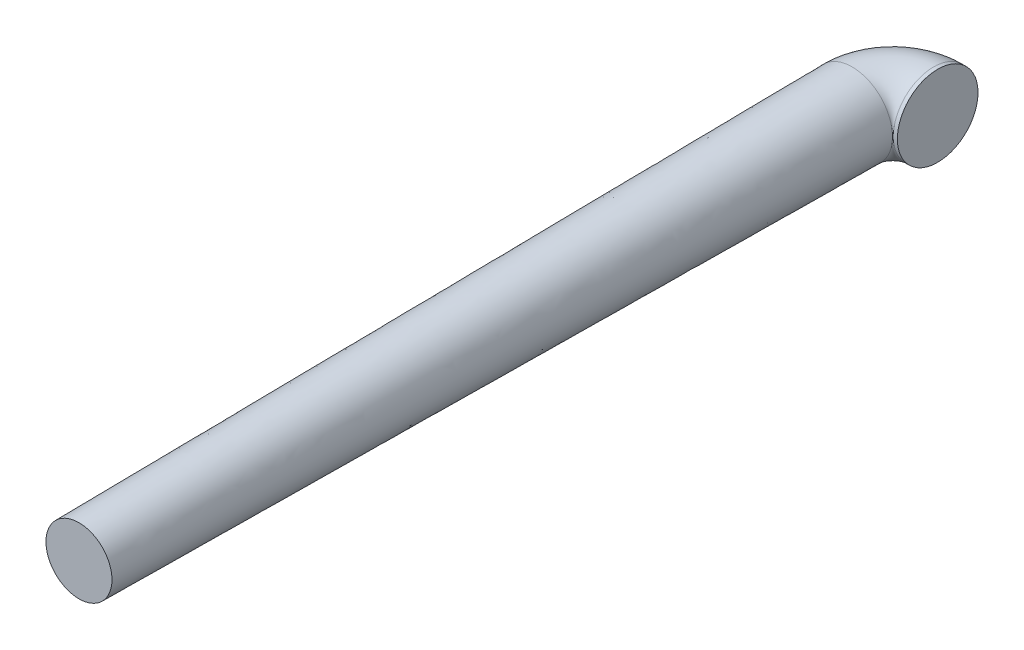
ISO-10303-21;
HEADER;
FILE_DESCRIPTION(('STEP AP214'),'2;1');
FILE_NAME('part.step','',(''),(''),'','','');
FILE_SCHEMA(('AUTOMOTIVE_DESIGN { 1 0 10303 214 1 1 1 1 }'));
ENDSEC;
DATA;
#1=APPLICATION_CONTEXT('core data for automotive mechanical design processes');
#2=APPLICATION_PROTOCOL_DEFINITION('international standard','automotive_design',2000,#1);
#3=PRODUCT_CONTEXT('',#1,'mechanical');
#4=PRODUCT('Part','Part','',(#3));
#5=PRODUCT_RELATED_PRODUCT_CATEGORY('part','',(#4));
#6=PRODUCT_DEFINITION_FORMATION('','',#4);
#7=PRODUCT_DEFINITION_CONTEXT('part definition',#1,'design');
#8=PRODUCT_DEFINITION('design','',#6,#7);
#9=PRODUCT_DEFINITION_SHAPE('','',#8);
#10=(LENGTH_UNIT() NAMED_UNIT(*) SI_UNIT(.MILLI.,.METRE.));
#11=(NAMED_UNIT(*) PLANE_ANGLE_UNIT() SI_UNIT($,.RADIAN.));
#12=(NAMED_UNIT(*) SI_UNIT($,.STERADIAN.) SOLID_ANGLE_UNIT());
#13=UNCERTAINTY_MEASURE_WITH_UNIT(LENGTH_MEASURE(1.E-05),#10,'distance_accuracy_value','');
#14=(GEOMETRIC_REPRESENTATION_CONTEXT(3) GLOBAL_UNCERTAINTY_ASSIGNED_CONTEXT((#13)) GLOBAL_UNIT_ASSIGNED_CONTEXT((#10,
#11,#12)) REPRESENTATION_CONTEXT('',''));
#15=CARTESIAN_POINT('',(0.,0.,0.));
#16=DIRECTION('',(0.,0.,1.));
#17=DIRECTION('',(1.,0.,0.));
#18=AXIS2_PLACEMENT_3D('',#15,#16,#17);
#19=CARTESIAN_POINT('',(0.539999999999999,0.,-10.));
#20=DIRECTION('',(-1.,0.,0.));
#21=DIRECTION('',(0.,0.,1.));
#22=AXIS2_PLACEMENT_3D('',#19,#20,#21);
#23=PLANE('',#22);
#24=CARTESIAN_POINT('',(0.539999999999999,0.,-10.));
#25=DIRECTION('',(1.,0.,0.));
#26=DIRECTION('',(0.,0.,-1.));
#27=AXIS2_PLACEMENT_3D('',#24,#25,#26);
#28=CIRCLE('',#27,0.495);
#29=CARTESIAN_POINT('',(0.539999999999999,0.,-10.495));
#30=VERTEX_POINT('',#29);
#31=EDGE_CURVE('E24',#30,#30,#28,.F.);
#32=ORIENTED_EDGE('',*,*,#31,.F.);
#33=EDGE_LOOP('',(#32));
#34=FACE_BOUND('',#33,.T.);
#35=ADVANCED_FACE('F17',(#34),#23,.F.);
#36=CARTESIAN_POINT('',(0.489999999999998,0.,-10.));
#37=DIRECTION('',(1.,0.,0.));
#38=DIRECTION('',(0.,0.,-1.));
#39=AXIS2_PLACEMENT_3D('',#36,#37,#38);
#40=CYLINDRICAL_SURFACE('',#39,0.495);
#41=CARTESIAN_POINT('',(0.489999999999805,0.,-10.));
#42=DIRECTION('',(1.,0.,-3.90982201687927E-13));
#43=DIRECTION('',(-3.90982201687927E-13,0.,-1.));
#44=AXIS2_PLACEMENT_3D('',#41,#42,#43);
#45=CIRCLE('',#44,0.495);
#46=CARTESIAN_POINT('',(0.489999999999611,0.,-10.495));
#47=VERTEX_POINT('',#46);
#48=EDGE_CURVE('E76',#47,#47,#45,.F.);
#49=ORIENTED_EDGE('',*,*,#48,.F.);
#50=EDGE_LOOP('',(#49));
#51=FACE_BOUND('',#50,.T.);
#52=ORIENTED_EDGE('',*,*,#31,.T.);
#53=EDGE_LOOP('',(#52));
#54=FACE_BOUND('',#53,.T.);
#55=ADVANCED_FACE('F85',(#51,#54),#40,.T.);
#56=CARTESIAN_POINT('',(0.,0.,0.));
#57=DIRECTION('',(0.,0.,1.));
#58=DIRECTION('',(1.,0.,0.));
#59=AXIS2_PLACEMENT_3D('',#56,#57,#58);
#60=PLANE('',#59);
#61=CARTESIAN_POINT('',(0.405,0.,0.));
#62=CARTESIAN_POINT('',(0.405001542596249,0.0228547633774567,0.));
#63=CARTESIAN_POINT('',(0.402970398994823,0.0456972250512238,0.));
#64=CARTESIAN_POINT('',(0.395089178677017,0.0907629467243884,0.));
#65=CARTESIAN_POINT('',(0.389230262427667,0.112984649029221,0.));
#66=CARTESIAN_POINT('',(0.373950730485416,0.156119825287532,0.));
#67=CARTESIAN_POINT('',(0.364536390196654,0.177035528996636,0.));
#68=CARTESIAN_POINT('',(0.342401176876951,0.217009374121165,0.));
#69=CARTESIAN_POINT('',(0.329684520750042,0.236069842218566,0.));
#70=CARTESIAN_POINT('',(0.300980172785983,0.271948883439179,0.));
#71=CARTESIAN_POINT('',(0.284954038104707,0.288736875650813,0.));
#72=CARTESIAN_POINT('',(0.250183749593743,0.319224855679917,0.));
#73=CARTESIAN_POINT('',(0.231437944176502,0.332922954075675,0.));
#74=CARTESIAN_POINT('',(0.192646035180543,0.356540872452389,0.));
#75=CARTESIAN_POINT('',(0.172672102927332,0.366580075497198,0.));
#76=CARTESIAN_POINT('',(0.131376166532101,0.383332787061944,0.));
#77=CARTESIAN_POINT('',(0.110054224527266,0.390046448748522,0.));
#78=CARTESIAN_POINT('',(0.0656161096194195,0.400154664445203,0.));
#79=CARTESIAN_POINT('',(0.0424623596364661,0.403386700101761,0.));
#80=CARTESIAN_POINT('',(-0.0040433761334895,0.405662259149176,0.));
#81=CARTESIAN_POINT('',(-0.0273952529373369,0.404707952909755,0.));
#82=CARTESIAN_POINT('',(-0.0725660048851475,0.398880193242576,0.));
#83=CARTESIAN_POINT('',(-0.0944075606433524,0.394177536676804,0.));
#84=CARTESIAN_POINT('',(-0.137070572210633,0.381325454809582,0.));
#85=CARTESIAN_POINT('',(-0.157891029002576,0.373172726264783,0.));
#86=CARTESIAN_POINT('',(-0.198724436969927,0.353262451378297,0.));
#87=CARTESIAN_POINT('',(-0.218676430295023,0.341379435070851,0.));
#88=CARTESIAN_POINT('',(-0.256240128646742,0.314386462766071,0.));
#89=CARTESIAN_POINT('',(-0.273854747991325,0.29928058763944,0.));
#90=CARTESIAN_POINT('',(-0.305769583823568,0.266520829479831,0.));
#91=CARTESIAN_POINT('',(-0.32013156464082,0.248927029701054,0.));
#92=CARTESIAN_POINT('',(-0.345737092972703,0.211598864979145,0.));
#93=CARTESIAN_POINT('',(-0.356979004857466,0.191863384817567,0.));
#94=CARTESIAN_POINT('',(-0.376134226210069,0.150762151263398,0.));
#95=CARTESIAN_POINT('',(-0.384036729184584,0.129391365467365,0.));
#96=CARTESIAN_POINT('',(-0.396228372744382,0.0856616750506403,0.));
#97=CARTESIAN_POINT('',(-0.400521333522775,0.0633038415344174,0.));
#98=CARTESIAN_POINT('',(-0.40525695107258,0.0177695161619468,0.));
#99=CARTESIAN_POINT('',(-0.405629509192079,-0.00541446505164305,0.));
#100=CARTESIAN_POINT('',(-0.402287083850721,-0.0514939878240806,0.));
#101=CARTESIAN_POINT('',(-0.398569416315595,-0.0743893299956501,0.));
#102=CARTESIAN_POINT('',(-0.387557016934989,-0.11844111605746,0.));
#103=CARTESIAN_POINT('',(-0.380391889147034,-0.139630369329,0.));
#104=CARTESIAN_POINT('',(-0.362762543380869,-0.180586111298094,0.));
#105=CARTESIAN_POINT('',(-0.35229871226101,-0.200352766498374,0.));
#106=CARTESIAN_POINT('',(-0.327761751546477,-0.238768495377668,0.));
#107=CARTESIAN_POINT('',(-0.313549277675605,-0.257329281682629,0.));
#108=CARTESIAN_POINT('',(-0.282037429086836,-0.291604862424477,0.));
#109=CARTESIAN_POINT('',(-0.264739444941532,-0.307320932511397,0.));
#110=CARTESIAN_POINT('',(-0.228496019062452,-0.334888607788293,0.));
#111=CARTESIAN_POINT('',(-0.209655076238607,-0.346878659548542,0.));
#112=CARTESIAN_POINT('',(-0.17028274537518,-0.367693425741129,0.));
#113=CARTESIAN_POINT('',(-0.149749837056345,-0.376515254451696,0.));
#114=CARTESIAN_POINT('',(-0.106692330199551,-0.391035840442591,0.));
#115=CARTESIAN_POINT('',(-0.0841211505729829,-0.396598027712381,0.));
#116=CARTESIAN_POINT('',(-0.0384056685053753,-0.403774014389198,0.));
#117=CARTESIAN_POINT('',(-0.0152621055927794,-0.405392664648672,0.));
#118=CARTESIAN_POINT('',(0.0529906452329302,-0.403998029757146,0.));
#119=CARTESIAN_POINT('',(0.0981348485662519,-0.395142784580845,0.));
#120=CARTESIAN_POINT('',(0.161803252257579,-0.371533254263514,0.));
#121=CARTESIAN_POINT('',(0.182441284388949,-0.361870057657774,0.));
#122=CARTESIAN_POINT('',(0.221871972405785,-0.339284503610415,0.));
#123=CARTESIAN_POINT('',(0.24066659484421,-0.326365672996562,0.));
#124=CARTESIAN_POINT('',(0.276023202937787,-0.297262120348318,0.));
#125=CARTESIAN_POINT('',(0.292546270143266,-0.281030087353186,0.));
#126=CARTESIAN_POINT('',(0.322497719174305,-0.245909292526004,0.));
#127=CARTESIAN_POINT('',(0.335923522061259,-0.227018337661375,0.));
#128=CARTESIAN_POINT('',(0.359038202971925,-0.187925125617231,0.));
#129=CARTESIAN_POINT('',(0.368835963787322,-0.167786879772428,0.));
#130=CARTESIAN_POINT('',(0.385069418525349,-0.126233138431881,0.));
#131=CARTESIAN_POINT('',(0.391509215923012,-0.104819237646174,0.));
#132=CARTESIAN_POINT('',(0.401974706049445,-0.0557477913829591,0.));
#133=CARTESIAN_POINT('',(0.40499811925146,-0.0278647526183939,0.));
#134=CARTESIAN_POINT('',(0.405,0.,0.));
#135=B_SPLINE_CURVE_WITH_KNOTS('',3,(#61,#62,#63,#64,#65,#66,#67,#68,#69,#70,#71,#72,#73,#74,
#75,#76,#77,#78,#79,#80,#81,#82,#83,#84,#85,#86,#87,#88,#89,#90,#91,#92,#93,#94,#95,#96,#97,#98,
#99,#100,#101,#102,#103,#104,#105,#106,#107,#108,#109,#110,#111,#112,#113,#114,#115,#116,#117,
#118,#119,#120,#121,#122,#123,#124,#125,#126,#127,#128,#129,#130,#131,#132,#133,#134),
.UNSPECIFIED.,.T.,.F.,(4,2,2,2,2,2,2,2,2,2,2,2,2,2,2,2,2,2,2,2,2,2,2,2,2,2,2,2,2,2,2,2,2,2,2,2,
4),(0.,0.0684644098231261,0.137087487072593,0.205590004849626,0.274005474590295,
0.343265531321645,0.412567825373776,0.479347437126673,0.546123972881124,0.615898019280907,
0.685635896256543,0.752366172986943,0.819160485147376,0.888498787303102,0.957749807054192,
1.02554844013204,1.09338254835709,1.16143452059291,1.22941437839568,1.29860772575729,
1.3678465060437,1.4346645875942,1.50147483590842,1.57124446731045,1.64098273413382,
1.70768512154536,1.77444811051515,1.84383852446897,1.91314353970878,2.04811548749116,
2.1162642903692,2.18433958265159,2.25346513506128,2.32264803880818,2.38954341654843,
2.45635685454805,2.53982933734642),.UNSPECIFIED.);
#136=CARTESIAN_POINT('',(0.405,0.,0.));
#137=VERTEX_POINT('',#136);
#138=EDGE_CURVE('E45',#137,#137,#135,.T.);
#139=ORIENTED_EDGE('',*,*,#138,.T.);
#140=EDGE_LOOP('',(#139));
#141=FACE_BOUND('',#140,.T.);
#142=ADVANCED_FACE('F69',(#141),#60,.T.);
#143=CARTESIAN_POINT('',(0.49,0.,-9.5));
#144=DIRECTION('',(0.,-1.,0.));
#145=DIRECTION('',(1.,0.,0.));
#146=AXIS2_PLACEMENT_3D('',#143,#144,#145);
#147=TOROIDAL_SURFACE('',#146,0.5,0.495);
#148=CARTESIAN_POINT('',(0.485,0.,-9.5));
#149=CARTESIAN_POINT('',(0.485000033931957,-0.0053984859546323,-9.5));
#150=CARTESIAN_POINT('',(0.484911687156082,-0.0107969699856748,-9.5));
#151=CARTESIAN_POINT('',(0.48455847576602,-0.0215881606595482,-9.5));
#152=CARTESIAN_POINT('',(0.484293611151833,-0.0269808673023791,-9.5));
#153=CARTESIAN_POINT('',(0.483587607662494,-0.0377547296587975,-9.5));
#154=CARTESIAN_POINT('',(0.483146468787344,-0.043135885372385,-9.5));
#155=CARTESIAN_POINT('',(0.482088399660043,-0.0538808863501394,-9.5));
#156=CARTESIAN_POINT('',(0.481471469407893,-0.0592447316143063,-9.5));
#157=CARTESIAN_POINT('',(0.48006247500843,-0.069949370257775,-9.5));
#158=CARTESIAN_POINT('',(0.479270410861117,-0.0752901636370767,-9.5));
#159=CARTESIAN_POINT('',(0.477511997247442,-0.0859429818685665,-9.5));
#160=CARTESIAN_POINT('',(0.47654564778108,-0.0912550067207545,-9.5));
#161=CARTESIAN_POINT('',(0.474439697682636,-0.101844602017087,-9.5));
#162=CARTESIAN_POINT('',(0.473300097050553,-0.107122172461232,-9.5));
#163=CARTESIAN_POINT('',(0.470848864479186,-0.117637209948329,-9.5));
#164=CARTESIAN_POINT('',(0.469537232539902,-0.122874676991282,-9.5));
#165=CARTESIAN_POINT('',(0.466743341281242,-0.133303901606352,-9.5));
#166=CARTESIAN_POINT('',(0.465261081961867,-0.138495659178469,-9.5));
#167=CARTESIAN_POINT('',(0.462127522524655,-0.148827907709248,-9.5));
#168=CARTESIAN_POINT('',(0.460476222406818,-0.15396839866791,-9.5));
#169=CARTESIAN_POINT('',(0.457006348886831,-0.164192611703646,-9.5));
#170=CARTESIAN_POINT('',(0.455187775484681,-0.16927633378072,-9.5));
#171=CARTESIAN_POINT('',(0.451385301957196,-0.17938156754935,-9.5));
#172=CARTESIAN_POINT('',(0.449401401831862,-0.184403079240905,-9.5));
#173=CARTESIAN_POINT('',(0.44527039838085,-0.19437851732318,-9.5));
#174=CARTESIAN_POINT('',(0.443123295055174,-0.199332443713899,-9.5));
#175=CARTESIAN_POINT('',(0.438668183415524,-0.209167408621,-9.5));
#176=CARTESIAN_POINT('',(0.43636017510155,-0.214048447137381,-9.5));
#177=CARTESIAN_POINT('',(0.431585723926474,-0.22373241173988,-9.5));
#178=CARTESIAN_POINT('',(0.429119281065372,-0.228535337825996,-9.5));
#179=CARTESIAN_POINT('',(0.424030600822057,-0.238057936621857,-9.5));
#180=CARTESIAN_POINT('',(0.421408363439843,-0.242777609331601,-9.5));
#181=CARTESIAN_POINT('',(0.416010900939341,-0.252128649541187,-9.5));
#182=CARTESIAN_POINT('',(0.413235675821051,-0.256760017041029,-9.5));
#183=CARTESIAN_POINT('',(0.407535208388127,-0.26592948951723,-9.5));
#184=CARTESIAN_POINT('',(0.404609966073493,-0.270467594493589,-9.5));
#185=CARTESIAN_POINT('',(0.398612595362708,-0.279445684435389,-9.5));
#186=CARTESIAN_POINT('',(0.395540466966558,-0.28388566940083,-9.5));
#187=CARTESIAN_POINT('',(0.38925261243119,-0.292662766858856,-9.5));
#188=CARTESIAN_POINT('',(0.386036886291973,-0.296999879351441,-9.5));
#189=CARTESIAN_POINT('',(0.379465278312776,-0.305566589514239,-9.5));
#190=CARTESIAN_POINT('',(0.376109396472797,-0.309796187184452,-9.5));
#191=CARTESIAN_POINT('',(0.36926106915395,-0.318143340434487,-9.5));
#192=CARTESIAN_POINT('',(0.365768623675083,-0.322260896014309,-9.5));
#193=CARTESIAN_POINT('',(0.358650907315041,-0.330379557742921,-9.5));
#194=CARTESIAN_POINT('',(0.355025636433867,-0.334380663891711,-9.5));
#195=CARTESIAN_POINT('',(0.347646149679171,-0.342262144062523,-9.5));
#196=CARTESIAN_POINT('',(0.34389193380565,-0.346142518084544,-9.5));
#197=CARTESIAN_POINT('',(0.336258575496094,-0.353778380535085,-9.5));
#198=CARTESIAN_POINT('',(0.33237943306006,-0.357533868963604,-9.5));
#199=CARTESIAN_POINT('',(0.324500373773951,-0.364915940435189,-9.5));
#200=CARTESIAN_POINT('',(0.320500456923875,-0.368542523478256,-9.5));
#201=CARTESIAN_POINT('',(0.312384130232421,-0.375662902364469,-9.5));
#202=CARTESIAN_POINT('',(0.308267720391043,-0.379156698207615,-9.5));
#203=CARTESIAN_POINT('',(0.299922813831249,-0.386007763012005,-9.5));
#204=CARTESIAN_POINT('',(0.295694317112834,-0.389365031973249,-9.5));
#205=CARTESIAN_POINT('',(0.287129762888554,-0.395939449467217,-9.5));
#206=CARTESIAN_POINT('',(0.282793705382689,-0.399156597999941,-9.5));
#207=CARTESIAN_POINT('',(0.274018670803788,-0.405447331072066,-9.5));
#208=CARTESIAN_POINT('',(0.269579693730752,-0.408520915611466,-9.5));
#209=CARTESIAN_POINT('',(0.260603571400623,-0.41452123079987,-9.5));
#210=CARTESIAN_POINT('',(0.25606642614353,-0.417447961448874,-9.5));
#211=CARTESIAN_POINT('',(0.246898823905459,-0.423151436148577,-9.5));
#212=CARTESIAN_POINT('',(0.242268366924481,-0.425928180199276,-9.5));
#213=CARTESIAN_POINT('',(0.232919097577622,-0.431328709536805,-9.5));
#214=CARTESIAN_POINT('',(0.228200285211741,-0.433952494823635,-9.5));
#215=CARTESIAN_POINT('',(0.218679356007712,-0.439044298191549,-9.5));
#216=CARTESIAN_POINT('',(0.213877239169564,-0.441512316272633,-9.5));
#217=CARTESIAN_POINT('',(0.204194841100908,-0.446289943516956,-9.5));
#218=CARTESIAN_POINT('',(0.199314559870399,-0.448599552680197,-9.5));
#219=CARTESIAN_POINT('',(0.189481056762367,-0.453057889934146,-9.5));
#220=CARTESIAN_POINT('',(0.184527834884844,-0.455206618024855,-9.5));
#221=CARTESIAN_POINT('',(0.174553752302188,-0.459340893182606,-9.5));
#222=CARTESIAN_POINT('',(0.169532891597055,-0.461326440249647,-9.5));
#223=CARTESIAN_POINT('',(0.159428905577696,-0.465132228074292,-9.5));
#224=CARTESIAN_POINT('',(0.154345780263469,-0.466952468831896,-9.5));
#225=CARTESIAN_POINT('',(0.144122705891097,-0.470425695692123,-9.5));
#226=CARTESIAN_POINT('',(0.138982756832953,-0.472078681794745,-9.5));
#227=CARTESIAN_POINT('',(0.128651536660808,-0.475215630025158,-9.5));
#228=CARTESIAN_POINT('',(0.123460265546807,-0.476699592152948,-9.5));
#229=CARTESIAN_POINT('',(0.113031957885003,-0.479496904033378,-9.5));
#230=CARTESIAN_POINT('',(0.1077949213372,-0.480810253786017,-9.5));
#231=CARTESIAN_POINT('',(0.0972806884161599,-0.483264935135549,-9.5));
#232=CARTESIAN_POINT('',(0.0920034920429221,-0.484406266732441,-9.5));
#233=CARTESIAN_POINT('',(0.0814145880655686,-0.486515690114321,-9.5));
#234=CARTESIAN_POINT('',(0.0761028804614528,-0.487483781899308,-9.5));
#235=CARTESIAN_POINT('',(0.0654506395569611,-0.489245689433292,-9.5));
#236=CARTESIAN_POINT('',(0.0601101062565852,-0.490039505182288,-9.5));
#237=CARTESIAN_POINT('',(0.0494059303485797,-0.491452010961427,-9.5));
#238=CARTESIAN_POINT('',(0.0440422877409501,-0.492070700991571,-9.5));
#239=CARTESIAN_POINT('',(0.0332976343431363,-0.493132293100847,-9.5));
#240=CARTESIAN_POINT('',(0.0279166235529519,-0.49357519517998,-9.5));
#241=CARTESIAN_POINT('',(0.0171429935052475,-0.494284737314623,-9.5));
#242=CARTESIAN_POINT('',(0.0117503742477274,-0.494551377370132,-9.5));
#243=CARTESIAN_POINT('',(0.000959299406017158,-0.494908110051897,-9.5));
#244=CARTESIAN_POINT('',(-0.00443915617817301,-0.494998202678152,-9.5));
#245=CARTESIAN_POINT('',(-0.0152361252854821,-0.495001744068247,-9.5));
#246=CARTESIAN_POINT('',(-0.0206346388086011,-0.494915192832087,-9.5));
#247=CARTESIAN_POINT('',(-0.0314259453440102,-0.494565539139887,-9.5));
#248=CARTESIAN_POINT('',(-0.0368187383563004,-0.494302436683846,-9.5));
#249=CARTESIAN_POINT('',(-0.0475928315434022,-0.493599962170947,-9.5));
#250=CARTESIAN_POINT('',(-0.0529741317182138,-0.493160590114088,-9.5));
#251=CARTESIAN_POINT('',(-0.0637194792053913,-0.492106046693712,-9.5));
#252=CARTESIAN_POINT('',(-0.0690835265177572,-0.491490875330195,-9.5));
#253=CARTESIAN_POINT('',(-0.0797886267221476,-0.490085391762338,-9.5));
#254=CARTESIAN_POINT('',(-0.0851296796141722,-0.489295079557997,-9.5));
#255=CARTESIAN_POINT('',(-0.0957830740327499,-0.487540160241307,-9.5));
#256=CARTESIAN_POINT('',(-0.101095415559303,-0.486575553128957,-9.5));
#257=CARTESIAN_POINT('',(-0.11168570103365,-0.484473076490165,-9.5));
#258=CARTESIAN_POINT('',(-0.116963644981443,-0.483335206963723,-9.5));
#259=CARTESIAN_POINT('',(-0.127479485904026,-0.480887423448118,-9.5));
#260=CARTESIAN_POINT('',(-0.132717382878815,-0.479577509458954,-9.5));
#261=CARTESIAN_POINT('',(-0.143147523324174,-0.476787039117443,-9.5));
#262=CARTESIAN_POINT('',(-0.148339766794745,-0.475306482765095,-9.5));
#263=CARTESIAN_POINT('',(-0.158673042575786,-0.472176312465107,-9.5));
#264=CARTESIAN_POINT('',(-0.163814074886258,-0.470526698517467,-9.5));
#265=CARTESIAN_POINT('',(-0.174039425473562,-0.467060178688593,-9.5));
#266=CARTESIAN_POINT('',(-0.179123743750394,-0.465243272807358,-9.5));
#267=CARTESIAN_POINT('',(-0.189230224225319,-0.461444114068915,-9.5));
#268=CARTESIAN_POINT('',(-0.194252386423411,-0.459461861211707,-9.5));
#269=CARTESIAN_POINT('',(-0.204229178767255,-0.455334129603089,-9.5));
#270=CARTESIAN_POINT('',(-0.209183808913007,-0.45318865085168,-9.5));
#271=CARTESIAN_POINT('',(-0.219020235176371,-0.44873676645791,-9.5));
#272=CARTESIAN_POINT('',(-0.223902031293983,-0.446430360815549,-9.5));
#273=CARTESIAN_POINT('',(-0.233587559092276,-0.441659081922998,-9.5));
#274=CARTESIAN_POINT('',(-0.238391290772957,-0.439194208672808,-9.5));
#275=CARTESIAN_POINT('',(-0.247915566705777,-0.434108668150753,-9.5));
#276=CARTESIAN_POINT('',(-0.252636110957916,-0.431488000878888,-9.5));
#277=CARTESIAN_POINT('',(-0.257312499999978,-0.428790773389261,-9.5));
#278=B_SPLINE_CURVE_WITH_KNOTS('',3,(#148,#149,#150,#151,#152,#153,#154,#155,#156,#157,#158,
#159,#160,#161,#162,#163,#164,#165,#166,#167,#168,#169,#170,#171,#172,#173,#174,#175,#176,#177,
#178,#179,#180,#181,#182,#183,#184,#185,#186,#187,#188,#189,#190,#191,#192,#193,#194,#195,#196,
#197,#198,#199,#200,#201,#202,#203,#204,#205,#206,#207,#208,#209,#210,#211,#212,#213,#214,#215,
#216,#217,#218,#219,#220,#221,#222,#223,#224,#225,#226,#227,#228,#229,#230,#231,#232,#233,#234,
#235,#236,#237,#238,#239,#240,#241,#242,#243,#244,#245,#246,#247,#248,#249,#250,#251,#252,#253,
#254,#255,#256,#257,#258,#259,#260,#261,#262,#263,#264,#265,#266,#267,#268,#269,#270,#271,#272,
#273,#274,#275,#276,#277),.UNSPECIFIED.,.F.,.F.,(4,2,2,2,2,2,2,2,2,2,2,2,2,2,2,2,2,2,2,2,2,2,2,
2,2,2,2,2,2,2,2,2,2,2,2,2,2,2,2,2,2,2,2,2,2,2,2,2,2,2,2,2,2,2,2,2,2,2,2,2,2,2,2,2,4),(0.,
0.0161947322780996,0.0323894645561992,0.0485841968342988,0.0647789291123984,0.080973661390498,
0.0971683936685978,0.113363125946697,0.129557858224797,0.145752590502897,0.161947322780996,
0.178142055059096,0.194336787337196,0.210531519615295,0.226726251893395,0.242920984171494,
0.259115716449594,0.275310448727694,0.291505181005793,0.307699913283893,0.323894645561992,
0.340089377840092,0.356284110118192,0.372478842396291,0.388673574674391,0.40486830695249,
0.42106303923059,0.43725777150869,0.45345250378679,0.469647236064889,0.485841968342989,
0.502036700621088,0.518231432899188,0.534426165177288,0.550620897455387,0.566815629733487,
0.583010362011586,0.599205094289686,0.615399826567785,0.631594558845885,0.647789291123985,
0.663984023402084,0.680178755680184,0.696373487958284,0.712568220236383,0.728762952514483,
0.744957684792583,0.761152417070682,0.777347149348782,0.793541881626881,0.809736613904981,
0.825931346183081,0.84212607846118,0.85832081073928,0.87451554301738,0.890710275295479,
0.906905007573579,0.923099739851678,0.939294472129778,0.955489204407878,0.971683936685977,
0.987878668964077,1.00407340124218,1.02026813352028,1.03646286579838),.UNSPECIFIED.);
#279=CARTESIAN_POINT('',(0.485375008119641,0.,-9.50000047589327));
#280=VERTEX_POINT('',#279);
#281=CARTESIAN_POINT('',(-0.257217664425232,-0.428625530869238,-9.50000095160493));
#282=VERTEX_POINT('',#281);
#283=EDGE_CURVE('E41',#280,#282,#278,.T.);
#284=ORIENTED_EDGE('',*,*,#283,.T.);
#285=CARTESIAN_POINT('',(-0.257312499999978,-0.428790773389261,-9.5));
#286=CARTESIAN_POINT('',(-0.261991853063458,-0.426091914789945,-9.5));
#287=CARTESIAN_POINT('',(-0.26662699218566,-0.423316401856895,-9.5));
#288=CARTESIAN_POINT('',(-0.27580395385303,-0.417615168855681,-9.5));
#289=CARTESIAN_POINT('',(-0.280345776398198,-0.414689448787517,-9.5));
#290=CARTESIAN_POINT('',(-0.28933121621702,-0.408690903048431,-9.5));
#291=CARTESIAN_POINT('',(-0.293774833490675,-0.40561807737751,-9.5));
#292=CARTESIAN_POINT('',(-0.302559106117889,-0.399328622755656,-9.5));
#293=CARTESIAN_POINT('',(-0.306899761471448,-0.396111993804724,-9.5));
#294=CARTESIAN_POINT('',(-0.315473456775851,-0.389538377504545,-9.5));
#295=CARTESIAN_POINT('',(-0.319706496726696,-0.386181390155299,-9.5));
#296=CARTESIAN_POINT('',(-0.328060425000551,-0.379330655461944,-9.5));
#297=CARTESIAN_POINT('',(-0.332181313323561,-0.375836908117835,-9.5));
#298=CARTESIAN_POINT('',(-0.340306521796195,-0.36871639757675,-9.5));
#299=CARTESIAN_POINT('',(-0.344310841945818,-0.365089634379774,-9.5));
#300=CARTESIAN_POINT('',(-0.352198622592652,-0.35770697905299,-9.5));
#301=CARTESIAN_POINT('',(-0.356082083089862,-0.353951086923183,-9.5));
#302=CARTESIAN_POINT('',(-0.363723982443481,-0.346314198981197,-9.5));
#303=CARTESIAN_POINT('',(-0.367482421299891,-0.342433203169019,-9.5));
#304=CARTESIAN_POINT('',(-0.374870249381578,-0.334550267204778,-9.5));
#305=CARTESIAN_POINT('',(-0.378499638606856,-0.330548327052716,-9.5));
#306=CARTESIAN_POINT('',(-0.385625477738305,-0.322427791365332,-9.5));
#307=CARTESIAN_POINT('',(-0.389121927644476,-0.31830919583001,-9.5));
#308=CARTESIAN_POINT('',(-0.395978140924115,-0.309959763355733,-9.5));
#309=CARTESIAN_POINT('',(-0.399337904297584,-0.305728926416778,-9.5));
#310=CARTESIAN_POINT('',(-0.405917143787664,-0.29715954540586,-9.5));
#311=CARTESIAN_POINT('',(-0.409136619904275,-0.292821001333897,-9.5));
#312=CARTESIAN_POINT('',(-0.415431834505131,-0.284040855759515,-9.5));
#313=CARTESIAN_POINT('',(-0.418507572989377,-0.279599254257094,-9.5));
#314=CARTESIAN_POINT('',(-0.424512015996413,-0.270617753972987,-9.5));
#315=CARTESIAN_POINT('',(-0.427440720519204,-0.2660778551913,-9.5));
#316=CARTESIAN_POINT('',(-0.433147956853417,-0.256904625846973,-9.5));
#317=CARTESIAN_POINT('',(-0.435926488664839,-0.252271295284333,-9.5));
#318=CARTESIAN_POINT('',(-0.441330401769432,-0.24291616800908,-9.5));
#319=CARTESIAN_POINT('',(-0.443955783062602,-0.238194371296466,-9.5));
#320=CARTESIAN_POINT('',(-0.449050581458213,-0.228667372163147,-9.5));
#321=CARTESIAN_POINT('',(-0.451519998560654,-0.223862169742443,-9.5));
#322=CARTESIAN_POINT('',(-0.456300222052204,-0.214173509022353,-9.5));
#323=CARTESIAN_POINT('',(-0.458611028441312,-0.209290050722968,-9.5));
#324=CARTESIAN_POINT('',(-0.463071553969796,-0.199450111943284,-9.5));
#325=CARTESIAN_POINT('',(-0.465221273109172,-0.194493631462986,-9.5));
#326=CARTESIAN_POINT('',(-0.469357320242144,-0.184512960278541,-9.5));
#327=CARTESIAN_POINT('',(-0.471343648235742,-0.179488769574395,-9.5));
#328=CARTESIAN_POINT('',(-0.475150784290602,-0.169378062465693,-9.5));
#329=CARTESIAN_POINT('',(-0.476971592351864,-0.164291546061137,-9.5));
#330=CARTESIAN_POINT('',(-0.480445737146444,-0.154061638870724,-9.5));
#331=CARTESIAN_POINT('',(-0.482099073879762,-0.148918248084866,-9.5));
#332=CARTESIAN_POINT('',(-0.48523650410514,-0.138580104404347,-9.5));
#333=CARTESIAN_POINT('',(-0.486720597597201,-0.133385351509685,-9.5));
#334=CARTESIAN_POINT('',(-0.489517950808046,-0.122950050929829,-9.5));
#335=CARTESIAN_POINT('',(-0.490831210526829,-0.117709503244634,-9.5));
#336=CARTESIAN_POINT('',(-0.493285488744995,-0.107188229481158,-9.5));
#337=CARTESIAN_POINT('',(-0.494426507244378,-0.101907503402877,-9.5));
#338=CARTESIAN_POINT('',(-0.4965350801719,-0.091311532310641,-9.5));
#339=CARTESIAN_POINT('',(-0.49750263460004,-0.0859962872966868,-9.5));
#340=CARTESIAN_POINT('',(-0.499263242438074,-0.0753369747851395,-9.5));
#341=CARTESIAN_POINT('',(-0.500056295847968,-0.0699929072875463,-9.5));
#342=CARTESIAN_POINT('',(-0.501467051718661,-0.0592816771503733,-9.5));
#343=CARTESIAN_POINT('',(-0.50208475417946,-0.0539145145107936,-9.5));
#344=CARTESIAN_POINT('',(-0.503144146148155,-0.0431628461828158,-9.5));
#345=CARTESIAN_POINT('',(-0.503585835656051,-0.0377783404944177,-9.5));
#346=CARTESIAN_POINT('',(-0.504292728351656,-0.0269977567488557,-9.5));
#347=CARTESIAN_POINT('',(-0.504557931539365,-0.0216016786916919,-9.5));
#348=CARTESIAN_POINT('',(-0.504911567371154,-0.0108037332909849,-9.5));
#349=CARTESIAN_POINT('',(-0.505000000015233,-0.00540186594744175,-9.5));
#350=CARTESIAN_POINT('',(-0.504999999984767,0.00540186873914589,-9.5));
#351=CARTESIAN_POINT('',(-0.504911567310223,0.0108037360821903,-9.5));
#352=CARTESIAN_POINT('',(-0.504557931417536,0.0216016814809029,-9.5));
#353=CARTESIAN_POINT('',(-0.504292728199394,0.026997759536571,-9.5));
#354=CARTESIAN_POINT('',(-0.503585835442989,0.0377783432781462,-9.5));
#355=CARTESIAN_POINT('',(-0.503144145904725,0.0431628489640533,-9.5));
#356=CARTESIAN_POINT('',(-0.502084753875393,0.0539145172860563,-9.5));
#357=CARTESIAN_POINT('',(-0.501467051384324,0.0592816799221523,-9.5));
#358=CARTESIAN_POINT('',(-0.500056295453222,0.0699929100513689,-9.5));
#359=CARTESIAN_POINT('',(-0.499263242013188,0.0753369775444894,-9.5));
#360=CARTESIAN_POINT('',(-0.497502634115038,0.0859962900461073,-9.5));
#361=CARTESIAN_POINT('',(-0.496535079656921,0.0913115350546046,-9.5));
#362=CARTESIAN_POINT('',(-0.494426506669639,0.101907506134948,-9.5));
#363=CARTESIAN_POINT('',(-0.493285488140475,0.107188232206795,-9.5));
#364=CARTESIAN_POINT('',(-0.49083120986297,0.117709505956429,-9.5));
#365=CARTESIAN_POINT('',(-0.489517950114631,0.122950053634217,-9.5));
#366=CARTESIAN_POINT('',(-0.486720596844933,0.133385354198297,-9.5));
#367=CARTESIAN_POINT('',(-0.485236503323575,0.138580107084589,-9.5));
#368=CARTESIAN_POINT('',(-0.482099073039892,0.148918250747414,-9.5));
#369=CARTESIAN_POINT('',(-0.480445736277567,0.154061641523946,-9.5));
#370=CARTESIAN_POINT('',(-0.476971591425292,0.164291548694766,-9.5));
#371=CARTESIAN_POINT('',(-0.475150783335343,0.169378065089053,-9.5));
#372=CARTESIAN_POINT('',(-0.47134364722346,0.179488772176284,-9.5));
#373=CARTESIAN_POINT('',(-0.469357319201527,0.184512962869227,-9.5));
#374=CARTESIAN_POINT('',(-0.465221272012265,0.194493634030345,-9.5));
#375=CARTESIAN_POINT('',(-0.463071552844936,0.19945011449852,-9.5));
#376=CARTESIAN_POINT('',(-0.458611027260957,0.209290053253047,-9.5));
#377=CARTESIAN_POINT('',(-0.456300220844307,0.2141735115394,-9.5));
#378=CARTESIAN_POINT('',(-0.451519997298115,0.22386217223253,-9.5));
#379=CARTESIAN_POINT('',(-0.449050580168574,0.228667374639308,-9.5));
#380=CARTESIAN_POINT('',(-0.443955781719232,0.238194373743892,-9.5));
#381=CARTESIAN_POINT('',(-0.441330400399431,0.2429161704417,-9.5));
#382=CARTESIAN_POINT('',(-0.435926487242078,0.252271297686476,-9.5));
#383=CARTESIAN_POINT('',(-0.433147955404525,0.256904628233446,-9.5));
#384=CARTESIAN_POINT('',(-0.427440719018576,0.266077857545585,-9.5));
#385=CARTESIAN_POINT('',(-0.424512014470182,0.270617756310754,-9.5));
#386=CARTESIAN_POINT('',(-0.418507571412491,0.279599256560998,-9.5));
#387=CARTESIAN_POINT('',(-0.415431832903196,0.284040858046072,-9.5));
#388=CARTESIAN_POINT('',(-0.409136618252821,0.292821003584951,-9.5));
#389=CARTESIAN_POINT('',(-0.405917142111741,0.297159547638756,-9.5));
#390=CARTESIAN_POINT('',(-0.399337902573332,0.305728928612568,-9.5));
#391=CARTESIAN_POINT('',(-0.395978139176002,0.309959765532575,-9.5));
#392=CARTESIAN_POINT('',(-0.389121925849273,0.318309197968185,-9.5));
#393=CARTESIAN_POINT('',(-0.385625475919875,0.322427793483787,-9.5));
#394=CARTESIAN_POINT('',(-0.378499636742628,0.330548329130982,-9.5));
#395=CARTESIAN_POINT('',(-0.37487024749478,0.334550269262576,-9.5));
#396=CARTESIAN_POINT('',(-0.367482419368634,0.34243320518515,-9.5));
#397=CARTESIAN_POINT('',(-0.363723980490336,0.346314200976132,-9.5));
#398=CARTESIAN_POINT('',(-0.356082081093646,0.353951088875019,-9.5));
#399=CARTESIAN_POINT('',(-0.352198620575254,0.357706980982924,-9.5));
#400=CARTESIAN_POINT('',(-0.344310839886784,0.365089636265222,-9.5));
#401=CARTESIAN_POINT('',(-0.340306519716706,0.368716399439615,-9.5));
#402=CARTESIAN_POINT('',(-0.332181311203914,0.375836909934875,-9.5));
#403=CARTESIAN_POINT('',(-0.3280604228612,0.379330657255743,-9.5));
#404=CARTESIAN_POINT('',(-0.319706494548708,0.386181391901984,-9.5));
#405=CARTESIAN_POINT('',(-0.31547345457893,0.389538379227356,-9.5));
#406=CARTESIAN_POINT('',(-0.306899759237453,0.396111995479181,-9.5));
#407=CARTESIAN_POINT('',(-0.302559103865753,0.399328624405632,-9.5));
#408=CARTESIAN_POINT('',(-0.293774831203068,0.405618078977945,-9.5));
#409=CARTESIAN_POINT('',(-0.289331213912083,0.408690904623805,-9.5));
#410=CARTESIAN_POINT('',(-0.280345774059429,0.414689450312215,-9.5));
#411=CARTESIAN_POINT('',(-0.275803951497761,0.417615170354763,-9.5));
#412=CARTESIAN_POINT('',(-0.266626989798238,0.423316403304221,-9.5));
#413=CARTESIAN_POINT('',(-0.261991850660382,0.426091916211131,-9.5));
#414=CARTESIAN_POINT('',(-0.257312497581681,0.428790774784056,-9.5));
#415=B_SPLINE_CURVE_WITH_KNOTS('',3,(#285,#286,#287,#288,#289,#290,#291,#292,#293,#294,#295,
#296,#297,#298,#299,#300,#301,#302,#303,#304,#305,#306,#307,#308,#309,#310,#311,#312,#313,#314,
#315,#316,#317,#318,#319,#320,#321,#322,#323,#324,#325,#326,#327,#328,#329,#330,#331,#332,#333,
#334,#335,#336,#337,#338,#339,#340,#341,#342,#343,#344,#345,#346,#347,#348,#349,#350,#351,#352,
#353,#354,#355,#356,#357,#358,#359,#360,#361,#362,#363,#364,#365,#366,#367,#368,#369,#370,#371,
#372,#373,#374,#375,#376,#377,#378,#379,#380,#381,#382,#383,#384,#385,#386,#387,#388,#389,#390,
#391,#392,#393,#394,#395,#396,#397,#398,#399,#400,#401,#402,#403,#404,#405,#406,#407,#408,#409,
#410,#411,#412,#413,#414),.UNSPECIFIED.,.F.,.F.,(4,2,2,2,2,2,2,2,2,2,2,2,2,2,2,2,2,2,2,2,2,2,2,
2,2,2,2,2,2,2,2,2,2,2,2,2,2,2,2,2,2,2,2,2,2,2,2,2,2,2,2,2,2,2,2,2,2,2,2,2,2,2,2,2,4),(0.,
0.0162048784175139,0.0324097568350277,0.0486146352525411,0.0648195136700548,0.0810243920875687,
0.0972292705050821,0.113434148922596,0.12963902734011,0.145843905757623,0.162048784175137,
0.178253662592651,0.194458541010165,0.210663419427678,0.226868297845192,0.243073176262706,
0.259278054680219,0.275482933097734,0.291687811515247,0.30789268993276,0.324097568350275,
0.340302446767788,0.356507325185302,0.372712203602816,0.38891708202033,0.405121960437843,
0.421326838855357,0.437531717272871,0.453736595690384,0.469941474107898,0.486146352525412,
0.502351230942925,0.518556109360439,0.534760987777953,0.550965866195466,0.56717074461298,
0.583375623030494,0.599580501448008,0.615785379865522,0.631990258283035,0.648195136700549,
0.664400015118063,0.680604893535576,0.69680977195309,0.713014650370604,0.729219528788117,
0.745424407205631,0.761629285623145,0.777834164040659,0.794039042458173,0.810243920875686,
0.8264487992932,0.842653677710714,0.858858556128228,0.875063434545741,0.891268312963255,
0.907473191380769,0.923678069798282,0.939882948215796,0.95608782663331,0.972292705050824,
0.988497583468337,1.00470246188585,1.02090734030336,1.03711221872088),.UNSPECIFIED.);
#416=CARTESIAN_POINT('',(-0.257217669104987,0.428625544629631,-9.50000190325736));
#417=VERTEX_POINT('',#416);
#418=EDGE_CURVE('E30',#282,#417,#415,.T.);
#419=ORIENTED_EDGE('',*,*,#418,.T.);
#420=CARTESIAN_POINT('',(-0.257312497581681,0.428790774784056,-9.5));
#421=CARTESIAN_POINT('',(-0.252636108537002,0.431488002240043,-9.5));
#422=CARTESIAN_POINT('',(-0.247915564282916,0.434108669478434,-9.5));
#423=CARTESIAN_POINT('',(-0.238391288347515,0.439194209933916,-9.5));
#424=CARTESIAN_POINT('',(-0.2335875566662,0.441659083151009,-9.5));
#425=CARTESIAN_POINT('',(-0.223902028867926,0.446430361977791,-9.5));
#426=CARTESIAN_POINT('',(-0.219020232750966,0.448736767587481,-9.5));
#427=CARTESIAN_POINT('',(-0.209183806490164,0.453188651916385,-9.5));
#428=CARTESIAN_POINT('',(-0.204229176346322,0.4553341306356,-9.5));
#429=CARTESIAN_POINT('',(-0.194252384007525,0.459461862180349,-9.5));
#430=CARTESIAN_POINT('',(-0.18923022181257,0.461444115005885,-9.5));
#431=CARTESIAN_POINT('',(-0.179123741345113,0.465243273681549,-9.5));
#432=CARTESIAN_POINT('',(-0.174039423072612,0.467060179531679,-9.5));
#433=CARTESIAN_POINT('',(-0.163814072495131,0.470526699298954,-9.5));
#434=CARTESIAN_POINT('',(-0.158673040190152,0.4721763132161,-9.5));
#435=CARTESIAN_POINT('',(-0.148339764421219,0.475306483455753,-9.5));
#436=CARTESIAN_POINT('',(-0.143147520957265,0.476787039778261,-9.5));
#437=CARTESIAN_POINT('',(-0.132717380526227,0.479577510060786,-9.5));
#438=CARTESIAN_POINT('',(-0.127479483559142,0.480887424020803,-9.5));
#439=CARTESIAN_POINT('',(-0.116963642653019,0.483335207478848,-9.5));
#440=CARTESIAN_POINT('',(-0.11168569871398,0.484473076976877,-9.5));
#441=CARTESIAN_POINT('',(-0.101095413258153,0.486575553559611,-9.5));
#442=CARTESIAN_POINT('',(-0.0957830717413638,0.487540160644317,-9.5));
#443=CARTESIAN_POINT('',(-0.0851296773432835,0.489295079906525,-9.5));
#444=CARTESIAN_POINT('',(-0.0797886244619919,0.490085392084026,-9.5));
#445=CARTESIAN_POINT('',(-0.0690835242799938,0.491490875599043,-9.5));
#446=CARTESIAN_POINT('',(-0.0637194769792872,0.49210604693656,-9.5));
#447=CARTESIAN_POINT('',(-0.0529741295163115,0.493160590305803,-9.5));
#448=CARTESIAN_POINT('',(-0.0475928293540424,0.493599962337531,-9.5));
#449=CARTESIAN_POINT('',(-0.0368187361928642,0.494302436801066,-9.5));
#450=CARTESIAN_POINT('',(-0.0314259431939551,0.494565539232874,-9.5));
#451=CARTESIAN_POINT('',(-0.0206346366861011,0.494915192877536,-9.5));
#452=CARTESIAN_POINT('',(-0.0152361231771563,0.49500174409039,-9.5));
#453=CARTESIAN_POINT('',(-0.00443915409894239,0.494998202654635,-9.5));
#454=CARTESIAN_POINT('',(0.000959301470326695,0.494908110006026,-9.5));
#455=CARTESIAN_POINT('',(0.0117503762814951,0.494551377280529,-9.5));
#456=CARTESIAN_POINT('',(0.0171429955233944,0.49428473720364,-9.5));
#457=CARTESIAN_POINT('',(0.0279166255392051,0.493575195027236,-9.5));
#458=CARTESIAN_POINT('',(0.0332976363131165,0.493132292927721,-9.5));
#459=CARTESIAN_POINT('',(0.0440422896777813,0.492070700778696,-9.5));
#460=CARTESIAN_POINT('',(0.0494059322685347,0.491452010729187,-9.5));
#461=CARTESIAN_POINT('',(0.0601101081422332,0.490039504912348,-9.5));
#462=CARTESIAN_POINT('',(0.0654506414251784,0.489245689145018,-9.5));
#463=CARTESIAN_POINT('',(0.0761028822943031,0.487483781575416,-9.5));
#464=CARTESIAN_POINT('',(0.0814145898804828,0.486515689773143,-9.5));
#465=CARTESIAN_POINT('',(0.0920034938215091,0.484406266357754,-9.5));
#466=CARTESIAN_POINT('',(0.0972806901763558,0.483264934744638,-9.5));
#467=CARTESIAN_POINT('',(0.107794923060209,0.48081025336373,-9.5));
#468=CARTESIAN_POINT('',(0.113031959589215,0.479496903595938,-9.5));
#469=CARTESIAN_POINT('',(0.123460267213072,0.476699591686284,-9.5));
#470=CARTESIAN_POINT('',(0.128651538307922,0.475215629544422,-9.5));
#471=CARTESIAN_POINT('',(0.13898275844146,0.472078681286952,-9.5));
#472=CARTESIAN_POINT('',(0.144122707480149,0.470425695171345,-9.5));
#473=CARTESIAN_POINT('',(0.154345781813355,0.46695246828624,-9.5));
#474=CARTESIAN_POINT('',(0.159428907107872,0.465132227516742,-9.5));
#475=CARTESIAN_POINT('',(0.169532893087609,0.461326439669403,-9.5));
#476=CARTESIAN_POINT('',(0.174553753772829,0.459340892591562,-9.5));
#477=CARTESIAN_POINT('',(0.184527836315505,0.455206617413304,-9.5));
#478=CARTESIAN_POINT('',(0.189481058172962,0.453057889312889,-9.5));
#479=CARTESIAN_POINT('',(0.199314561240758,0.448599552040618,-9.5));
#480=CARTESIAN_POINT('',(0.204194842451097,0.446289942868763,-9.5));
#481=CARTESIAN_POINT('',(0.213877240479361,0.441512315608297,-9.5));
#482=CARTESIAN_POINT('',(0.218679357297286,0.439044297519686,-9.5));
#483=CARTESIAN_POINT('',(0.228200286460864,0.433952494137799,-9.5));
#484=CARTESIAN_POINT('',(0.232919098806518,0.431328708844523,-9.5));
#485=CARTESIAN_POINT('',(0.242268368112967,0.425928179495176,-9.5));
#486=CARTESIAN_POINT('',(0.246898825073763,0.423151435439105,-9.5));
#487=CARTESIAN_POINT('',(0.256066427271561,0.41744796072972,-9.5));
#488=CARTESIAN_POINT('',(0.260603572508564,0.414521230076406,-9.5));
#489=CARTESIAN_POINT('',(0.269579694798654,0.408520914880433,-9.5));
#490=CARTESIAN_POINT('',(0.274018671851741,0.405447330337774,-9.5));
#491=CARTESIAN_POINT('',(0.282793706390931,0.399156597260168,-9.5));
#492=CARTESIAN_POINT('',(0.287129763877035,0.395939448725221,-9.5));
#493=CARTESIAN_POINT('',(0.295694318062026,0.389365031227828,-9.5));
#494=CARTESIAN_POINT('',(0.299922814760913,0.386007762265381,-9.5));
#495=CARTESIAN_POINT('',(0.30826772128193,0.379156697459589,-9.5));
#496=CARTESIAN_POINT('',(0.312384131104059,0.375662901616243,-9.5));
#497=CARTESIAN_POINT('',(0.320500457757339,0.368542522730612,-9.5));
#498=CARTESIAN_POINT('',(0.324500374588489,0.364915939688327,-9.5));
#499=CARTESIAN_POINT('',(0.332379433837114,0.357533868219266,-9.5));
#500=CARTESIAN_POINT('',(0.336258576254589,0.35377837979249,-9.5));
#501=CARTESIAN_POINT('',(0.343891934527436,0.346142517346372,-9.5));
#502=CARTESIAN_POINT('',(0.347646150382808,0.34226214332703,-9.5));
#503=CARTESIAN_POINT('',(0.355025637101654,0.334380663162489,-9.5));
#504=CARTESIAN_POINT('',(0.358650907965128,0.33037955701729,-9.5));
#505=CARTESIAN_POINT('',(0.365768624290259,0.322260895296746,-9.5));
#506=CARTESIAN_POINT('',(0.369261069751916,0.318143339721401,-9.5));
#507=CARTESIAN_POINT('',(0.376109397036871,0.309796186481174,-9.5));
#508=CARTESIAN_POINT('',(0.379465278860168,0.305566588816293,-9.5));
#509=CARTESIAN_POINT('',(0.386036886806567,0.296999878664987,-9.5));
#510=CARTESIAN_POINT('',(0.389252612929668,0.292662766178561,-9.5));
#511=CARTESIAN_POINT('',(0.395540467433405,0.283885668733647,-9.5));
#512=CARTESIAN_POINT('',(0.39861259581404,0.279445683775159,-9.5));
#513=CARTESIAN_POINT('',(0.404609966494431,0.270467593848027,-9.5));
#514=CARTESIAN_POINT('',(0.407535208794186,0.265929488879383,-9.5));
#515=CARTESIAN_POINT('',(0.41323567619802,0.256760016419339,-9.5));
#516=CARTESIAN_POINT('',(0.416010901302099,0.252128648927939,-9.5));
#517=CARTESIAN_POINT('',(0.421408363774879,0.242777608735929,-9.5));
#518=CARTESIAN_POINT('',(0.424030601143581,0.238057936035318,-9.5));
#519=CARTESIAN_POINT('',(0.429119281360604,0.228535337258379,-9.5));
#520=CARTESIAN_POINT('',(0.431585724208925,0.223732411182051,-9.5));
#521=CARTESIAN_POINT('',(0.436360175359194,0.214048446599745,-9.5));
#522=CARTESIAN_POINT('',(0.438668183661143,0.209167408093767,-9.5));
#523=CARTESIAN_POINT('',(0.443123295277526,0.199332443208052,-9.5));
#524=CARTESIAN_POINT('',(0.445270398591962,0.194378516828314,-9.5));
#525=CARTESIAN_POINT('',(0.449401402021298,0.184403078768539,-9.5));
#526=CARTESIAN_POINT('',(0.451385302136199,0.179381567088501,-9.5));
#527=CARTESIAN_POINT('',(0.455187775643647,0.169276333343403,-9.5));
#528=CARTESIAN_POINT('',(0.457006349036193,0.164192611278342,-9.5));
#529=CARTESIAN_POINT('',(0.460476222537825,0.153968398267086,-9.5));
#530=CARTESIAN_POINT('',(0.46212752264691,0.14882790732089,-9.5));
#531=CARTESIAN_POINT('',(0.465261082067488,0.138495658815455,-9.5));
#532=CARTESIAN_POINT('',(0.466743341378981,0.133303901256214,-9.5));
#533=CARTESIAN_POINT('',(0.469537232622763,0.122874676667265,-9.5));
#534=CARTESIAN_POINT('',(0.470848864555051,0.117637209637556,-9.5));
#535=CARTESIAN_POINT('',(0.47330009711333,0.107122172177267,-9.5));
#536=CARTESIAN_POINT('',(0.47443969773932,0.101844601746688,-9.5));
#537=CARTESIAN_POINT('',(0.476545647826494,0.0912550064777632,-9.5));
#538=CARTESIAN_POINT('',(0.477511997287678,0.085942981639418,-9.5));
#539=CARTESIAN_POINT('',(0.479270410891923,0.0752901634358456,-9.5));
#540=CARTESIAN_POINT('',(0.480062475034984,0.0699493700706184,-9.5));
#541=CARTESIAN_POINT('',(0.481471469426879,0.0592447314554846,-9.5));
#542=CARTESIAN_POINT('',(0.482088399675712,0.0538808862055781,-9.5));
#543=CARTESIAN_POINT('',(0.483146468797322,0.0431358852564842,-9.5));
#544=CARTESIAN_POINT('',(0.483587607670099,0.0377547295572968,-9.5));
#545=CARTESIAN_POINT('',(0.484293611155637,0.026980867229772,-9.5));
#546=CARTESIAN_POINT('',(0.484558475768398,0.0215881606014345,-9.5));
#547=CARTESIAN_POINT('',(0.484911687156558,0.0107969699565947,-9.5));
#548=CARTESIAN_POINT('',(0.485000033931956,0.00539848594009229,-9.5));
#549=CARTESIAN_POINT('',(0.485,0.,-9.5));
#550=B_SPLINE_CURVE_WITH_KNOTS('',3,(#420,#421,#422,#423,#424,#425,#426,#427,#428,#429,#430,
#431,#432,#433,#434,#435,#436,#437,#438,#439,#440,#441,#442,#443,#444,#445,#446,#447,#448,#449,
#450,#451,#452,#453,#454,#455,#456,#457,#458,#459,#460,#461,#462,#463,#464,#465,#466,#467,#468,
#469,#470,#471,#472,#473,#474,#475,#476,#477,#478,#479,#480,#481,#482,#483,#484,#485,#486,#487,
#488,#489,#490,#491,#492,#493,#494,#495,#496,#497,#498,#499,#500,#501,#502,#503,#504,#505,#506,
#507,#508,#509,#510,#511,#512,#513,#514,#515,#516,#517,#518,#519,#520,#521,#522,#523,#524,#525,
#526,#527,#528,#529,#530,#531,#532,#533,#534,#535,#536,#537,#538,#539,#540,#541,#542,#543,#544,
#545,#546,#547,#548,#549),.UNSPECIFIED.,.F.,.F.,(4,2,2,2,2,2,2,2,2,2,2,2,2,2,2,2,2,2,2,2,2,2,2,
2,2,2,2,2,2,2,2,2,2,2,2,2,2,2,2,2,2,2,2,2,2,2,2,2,2,2,2,2,2,2,2,2,2,2,2,2,2,2,2,2,4),(0.,
0.016194732234485,0.0323894644689702,0.0485841967034552,0.0647789289379404,0.0809736611724255,
0.0971683934069104,0.113363125641395,0.129557857875881,0.145752590110366,0.161947322344851,
0.178142054579336,0.194336786813821,0.210531519048306,0.226726251282791,0.242920983517276,
0.259115715751761,0.275310447986246,0.291505180220731,0.307699912455216,0.323894644689701,
0.340089376924187,0.356284109158672,0.372478841393157,0.388673573627642,0.404868305862127,
0.421063038096612,0.437257770331097,0.453452502565582,0.469647234800067,0.485841967034552,
0.502036699269037,0.518231431503522,0.534426163738008,0.550620895972493,0.566815628206978,
0.583010360441463,0.599205092675948,0.615399824910433,0.631594557144918,0.647789289379403,
0.663984021613888,0.680178753848373,0.696373486082858,0.712568218317343,0.728762950551828,
0.744957682786314,0.761152415020799,0.777347147255284,0.793541879489769,0.809736611724254,
0.825931343958739,0.842126076193224,0.858320808427709,0.874515540662194,0.890710272896679,
0.906905005131165,0.923099737365649,0.939294469600135,0.95548920183462,0.971683934069104,
0.98787866630359,1.00407339853807,1.02026813077256,1.03646286300704),.UNSPECIFIED.);
#551=EDGE_CURVE('E11',#417,#280,#550,.T.);
#552=ORIENTED_EDGE('',*,*,#551,.T.);
#553=EDGE_LOOP('',(#284,#419,#552));
#554=FACE_BOUND('',#553,.T.);
#555=ORIENTED_EDGE('',*,*,#48,.T.);
#556=EDGE_LOOP('',(#555));
#557=FACE_BOUND('',#556,.T.);
#558=ADVANCED_FACE('F49',(#554,#557),#147,.T.);
#559=CARTESIAN_POINT('',(0.405,0.,0.));
#560=CARTESIAN_POINT('',(0.433333333333333,0.,-3.33333333333333));
#561=CARTESIAN_POINT('',(0.461666666666667,0.,-6.66666666666667));
#562=CARTESIAN_POINT('',(0.49,0.,-10.));
#563=CARTESIAN_POINT('',(0.405,0.106028752058656,0.));
#564=CARTESIAN_POINT('',(0.433333333333333,0.114319066005629,-3.33333333333333));
#565=CARTESIAN_POINT('',(0.461666666666667,0.122609379952602,-6.66666666666667));
#566=CARTESIAN_POINT('',(0.49,0.130899693899575,-10.));
#567=CARTESIAN_POINT('',(0.361351895961974,0.211404596799129,0.));
#568=CARTESIAN_POINT('',(0.386272414576285,0.227934174326633,-3.33333333333333));
#569=CARTESIAN_POINT('',(0.411192933190596,0.244463751854137,-6.66666666666667));
#570=CARTESIAN_POINT('',(0.436113451804906,0.260993329381641,-10.));
#571=CARTESIAN_POINT('',(0.211404596799129,0.361351895961974,0.));
#572=CARTESIAN_POINT('',(0.2246008409933,0.389605747909618,-3.33333333333333));
#573=CARTESIAN_POINT('',(0.237797085187471,0.417859599857262,-6.66666666666667));
#574=CARTESIAN_POINT('',(0.250993329381641,0.446113451804906,-10.));
#575=CARTESIAN_POINT('',(0.106028752058656,0.405,0.));
#576=CARTESIAN_POINT('',(0.110985732672295,0.436666666666667,-3.33333333333333));
#577=CARTESIAN_POINT('',(0.115942713285935,0.468333333333333,-6.66666666666667));
#578=CARTESIAN_POINT('',(0.120899693899575,0.5,-10.));
#579=CARTESIAN_POINT('',(-0.106028752058656,0.405,0.));
#580=CARTESIAN_POINT('',(-0.117652399338962,0.436666666666667,-3.33333333333333));
#581=CARTESIAN_POINT('',(-0.129276046619268,0.468333333333333,-6.66666666666667));
#582=CARTESIAN_POINT('',(-0.140899693899575,0.5,-10.));
#583=CARTESIAN_POINT('',(-0.211404596799129,0.361351895961974,0.));
#584=CARTESIAN_POINT('',(-0.231267507659967,0.389605747909618,-3.33333333333333));
#585=CARTESIAN_POINT('',(-0.251130418520804,0.417859599857262,-6.66666666666667));
#586=CARTESIAN_POINT('',(-0.270993329381641,0.446113451804906,-10.));
#587=CARTESIAN_POINT('',(-0.361351895961974,0.211404596799129,0.));
#588=CARTESIAN_POINT('',(-0.392939081242952,0.227934174326633,-3.33333333333333));
#589=CARTESIAN_POINT('',(-0.424526266523929,0.244463751854137,-6.66666666666667));
#590=CARTESIAN_POINT('',(-0.456113451804906,0.260993329381641,-10.));
#591=CARTESIAN_POINT('',(-0.405,0.106028752058656,0.));
#592=CARTESIAN_POINT('',(-0.44,0.114319066005629,-3.33333333333333));
#593=CARTESIAN_POINT('',(-0.475,0.122609379952602,-6.66666666666667));
#594=CARTESIAN_POINT('',(-0.51,0.130899693899575,-10.));
#595=CARTESIAN_POINT('',(-0.405,-0.106028752058655,0.));
#596=CARTESIAN_POINT('',(-0.44,-0.114319066005629,-3.33333333333333));
#597=CARTESIAN_POINT('',(-0.475,-0.122609379952602,-6.66666666666667));
#598=CARTESIAN_POINT('',(-0.51,-0.130899693899575,-10.));
#599=CARTESIAN_POINT('',(-0.361351895961974,-0.211404596799129,0.));
#600=CARTESIAN_POINT('',(-0.392939081242952,-0.227934174326633,-3.33333333333333));
#601=CARTESIAN_POINT('',(-0.424526266523929,-0.244463751854137,-6.66666666666667));
#602=CARTESIAN_POINT('',(-0.456113451804906,-0.260993329381641,-10.));
#603=CARTESIAN_POINT('',(-0.211404596799129,-0.361351895961974,0.));
#604=CARTESIAN_POINT('',(-0.231267507659967,-0.389605747909618,-3.33333333333333));
#605=CARTESIAN_POINT('',(-0.251130418520804,-0.417859599857262,-6.66666666666667));
#606=CARTESIAN_POINT('',(-0.270993329381641,-0.446113451804906,-10.));
#607=CARTESIAN_POINT('',(-0.106028752058656,-0.405,0.));
#608=CARTESIAN_POINT('',(-0.117652399338962,-0.436666666666667,-3.33333333333333));
#609=CARTESIAN_POINT('',(-0.129276046619268,-0.468333333333333,-6.66666666666667));
#610=CARTESIAN_POINT('',(-0.140899693899575,-0.5,-10.));
#611=CARTESIAN_POINT('',(0.106028752058655,-0.405,0.));
#612=CARTESIAN_POINT('',(0.110985732672295,-0.436666666666667,-3.33333333333333));
#613=CARTESIAN_POINT('',(0.115942713285935,-0.468333333333333,-6.66666666666667));
#614=CARTESIAN_POINT('',(0.120899693899575,-0.5,-10.));
#615=CARTESIAN_POINT('',(0.211404596799129,-0.361351895961974,0.));
#616=CARTESIAN_POINT('',(0.2246008409933,-0.389605747909618,-3.33333333333333));
#617=CARTESIAN_POINT('',(0.23779708518747,-0.417859599857262,-6.66666666666667));
#618=CARTESIAN_POINT('',(0.250993329381641,-0.446113451804906,-10.));
#619=CARTESIAN_POINT('',(0.361351895961974,-0.211404596799129,0.));
#620=CARTESIAN_POINT('',(0.386272414576285,-0.227934174326633,-3.33333333333333));
#621=CARTESIAN_POINT('',(0.411192933190596,-0.244463751854137,-6.66666666666667));
#622=CARTESIAN_POINT('',(0.436113451804906,-0.260993329381641,-10.));
#623=CARTESIAN_POINT('',(0.405,-0.106028752058656,0.));
#624=CARTESIAN_POINT('',(0.433333333333333,-0.114319066005629,-3.33333333333333));
#625=CARTESIAN_POINT('',(0.461666666666667,-0.122609379952602,-6.66666666666667));
#626=CARTESIAN_POINT('',(0.49,-0.130899693899575,-10.));
#627=CARTESIAN_POINT('',(0.405,0.,0.));
#628=CARTESIAN_POINT('',(0.433333333333333,0.,-3.33333333333333));
#629=CARTESIAN_POINT('',(0.461666666666667,0.,-6.66666666666667));
#630=CARTESIAN_POINT('',(0.49,0.,-10.));
#631=B_SPLINE_SURFACE_WITH_KNOTS('',3,3,((#559,#560,#561,#562),(#563,#564,#565,#566),(#567,#568,
#569,#570),(#571,#572,#573,#574),(#575,#576,#577,#578),(#579,#580,#581,#582),(#583,#584,#585,
#586),(#587,#588,#589,#590),(#591,#592,#593,#594),(#595,#596,#597,#598),(#599,#600,#601,#602),
(#603,#604,#605,#606),(#607,#608,#609,#610),(#611,#612,#613,#614),(#615,#616,#617,#618),(#619,
#620,#621,#622),(#623,#624,#625,#626),(#627,#628,#629,#630)),.UNSPECIFIED.,.T.,.F.,.F.,(4,2,2,2,
2,2,2,2,4),(4,4),(0.,0.125,0.25,0.375,0.5,0.625,0.75,0.875,1.),(0.,1.),.UNSPECIFIED.);
#632=ORIENTED_EDGE('',*,*,#138,.F.);
#633=EDGE_LOOP('',(#632));
#634=FACE_BOUND('',#633,.T.);
#635=ORIENTED_EDGE('',*,*,#418,.F.);
#636=ORIENTED_EDGE('',*,*,#283,.F.);
#637=ORIENTED_EDGE('',*,*,#551,.F.);
#638=EDGE_LOOP('',(#635,#636,#637));
#639=FACE_BOUND('',#638,.T.);
#640=ADVANCED_FACE('F19',(#634,#639),#631,.F.);
#641=CLOSED_SHELL('',(#35,#55,#142,#558,#640));
#642=MANIFOLD_SOLID_BREP('B1',#641);
#643=ADVANCED_BREP_SHAPE_REPRESENTATION('',(#18,#642),#14);
#644=SHAPE_DEFINITION_REPRESENTATION(#9,#643);
ENDSEC;
END-ISO-10303-21;
